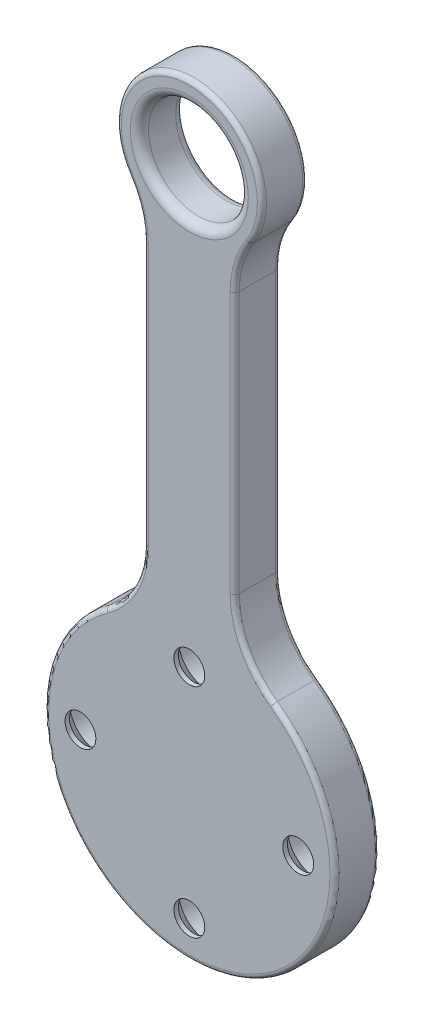
ISO-10303-21;
HEADER;
FILE_DESCRIPTION(('STEP AP214'),'2;1');
FILE_NAME('part.step','',(''),(''),'','','');
FILE_SCHEMA(('AUTOMOTIVE_DESIGN { 1 0 10303 214 1 1 1 1 }'));
ENDSEC;
DATA;
#1=APPLICATION_CONTEXT('core data for automotive mechanical design processes');
#2=APPLICATION_PROTOCOL_DEFINITION('international standard','automotive_design',2000,#1);
#3=PRODUCT_CONTEXT('',#1,'mechanical');
#4=PRODUCT('Part','Part','',(#3));
#5=PRODUCT_RELATED_PRODUCT_CATEGORY('part','',(#4));
#6=PRODUCT_DEFINITION_FORMATION('','',#4);
#7=PRODUCT_DEFINITION_CONTEXT('part definition',#1,'design');
#8=PRODUCT_DEFINITION('design','',#6,#7);
#9=PRODUCT_DEFINITION_SHAPE('','',#8);
#10=(LENGTH_UNIT() NAMED_UNIT(*) SI_UNIT(.MILLI.,.METRE.));
#11=(NAMED_UNIT(*) PLANE_ANGLE_UNIT() SI_UNIT($,.RADIAN.));
#12=(NAMED_UNIT(*) SI_UNIT($,.STERADIAN.) SOLID_ANGLE_UNIT());
#13=UNCERTAINTY_MEASURE_WITH_UNIT(LENGTH_MEASURE(1.E-05),#10,'distance_accuracy_value','');
#14=(GEOMETRIC_REPRESENTATION_CONTEXT(3) GLOBAL_UNCERTAINTY_ASSIGNED_CONTEXT((#13)) GLOBAL_UNIT_ASSIGNED_CONTEXT((#10,
#11,#12)) REPRESENTATION_CONTEXT('',''));
#15=CARTESIAN_POINT('',(0.,0.,0.));
#16=DIRECTION('',(0.,0.,1.));
#17=DIRECTION('',(1.,0.,0.));
#18=AXIS2_PLACEMENT_3D('',#15,#16,#17);
#19=CARTESIAN_POINT('',(0.,60.,0.));
#20=DIRECTION('',(0.,0.,1.));
#21=DIRECTION('',(1.,0.,0.));
#22=AXIS2_PLACEMENT_3D('',#19,#20,#21);
#23=CYLINDRICAL_SURFACE('',#22,8.);
#24=DIRECTION('',(0.,0.,1.));
#25=VECTOR('',#24,1.);
#26=CARTESIAN_POINT('',(6.66666666666667,55.5778336128595,0.));
#27=LINE('',#26,#25);
#28=CARTESIAN_POINT('',(6.66666666666667,55.5778336128595,4.5));
#29=VERTEX_POINT('',#28);
#30=CARTESIAN_POINT('',(6.66666666666667,55.5778336128595,0.5));
#31=VERTEX_POINT('',#30);
#32=EDGE_CURVE('E475',#29,#31,#27,.F.);
#33=ORIENTED_EDGE('',*,*,#32,.T.);
#34=CARTESIAN_POINT('',(0.,60.,0.5));
#35=DIRECTION('',(0.,0.,1.));
#36=DIRECTION('',(1.,0.,0.));
#37=AXIS2_PLACEMENT_3D('',#34,#35,#36);
#38=CIRCLE('',#37,8.);
#39=CARTESIAN_POINT('',(-6.66666666666667,55.5778336128595,0.5));
#40=VERTEX_POINT('',#39);
#41=EDGE_CURVE('E207',#31,#40,#38,.T.);
#42=ORIENTED_EDGE('',*,*,#41,.T.);
#43=DIRECTION('',(0.,0.,1.));
#44=VECTOR('',#43,1.);
#45=CARTESIAN_POINT('',(-6.66666666666667,55.5778336128595,0.));
#46=LINE('',#45,#44);
#47=CARTESIAN_POINT('',(-6.66666666666667,55.5778336128595,4.5));
#48=VERTEX_POINT('',#47);
#49=EDGE_CURVE('E477',#40,#48,#46,.T.);
#50=ORIENTED_EDGE('',*,*,#49,.T.);
#51=CARTESIAN_POINT('',(0.,60.,4.5));
#52=DIRECTION('',(0.,0.,1.));
#53=DIRECTION('',(1.,0.,0.));
#54=AXIS2_PLACEMENT_3D('',#51,#52,#53);
#55=CIRCLE('',#54,8.);
#56=EDGE_CURVE('E205',#48,#29,#55,.F.);
#57=ORIENTED_EDGE('',*,*,#56,.T.);
#58=EDGE_LOOP('',(#33,#42,#50,#57));
#59=FACE_BOUND('',#58,.T.);
#60=ADVANCED_FACE('F44',(#59),#23,.T.);
#61=CARTESIAN_POINT('',(5.,13.076696830622,0.));
#62=DIRECTION('',(1.,0.,0.));
#63=DIRECTION('',(0.,1.,0.));
#64=AXIS2_PLACEMENT_3D('',#61,#62,#63);
#65=PLANE('',#64);
#66=DIRECTION('',(0.,0.,1.));
#67=VECTOR('',#66,1.);
#68=CARTESIAN_POINT('',(5.,21.2367605815953,0.));
#69=LINE('',#68,#67);
#70=CARTESIAN_POINT('',(5.,21.2367605815953,4.5));
#71=VERTEX_POINT('',#70);
#72=CARTESIAN_POINT('',(5.,21.2367605815953,0.5));
#73=VERTEX_POINT('',#72);
#74=EDGE_CURVE('E466',#71,#73,#69,.F.);
#75=ORIENTED_EDGE('',*,*,#74,.T.);
#76=DIRECTION('',(0.,1.,0.));
#77=VECTOR('',#76,1.);
#78=CARTESIAN_POINT('',(5.,50.0501256289338,0.5));
#79=LINE('',#78,#77);
#80=CARTESIAN_POINT('',(5.,50.0501256289338,0.5));
#81=VERTEX_POINT('',#80);
#82=EDGE_CURVE('E199',#73,#81,#79,.T.);
#83=ORIENTED_EDGE('',*,*,#82,.T.);
#84=DIRECTION('',(0.,0.,-1.));
#85=VECTOR('',#84,1.);
#86=CARTESIAN_POINT('',(5.,50.0501256289338,5.));
#87=LINE('',#86,#85);
#88=CARTESIAN_POINT('',(5.,50.0501256289338,4.5));
#89=VERTEX_POINT('',#88);
#90=EDGE_CURVE('E463',#81,#89,#87,.F.);
#91=ORIENTED_EDGE('',*,*,#90,.T.);
#92=DIRECTION('',(0.,1.,0.));
#93=VECTOR('',#92,1.);
#94=CARTESIAN_POINT('',(5.,13.076696830622,4.5));
#95=LINE('',#94,#93);
#96=EDGE_CURVE('E197',#89,#71,#95,.F.);
#97=ORIENTED_EDGE('',*,*,#96,.T.);
#98=EDGE_LOOP('',(#75,#83,#91,#97));
#99=FACE_BOUND('',#98,.T.);
#100=ADVANCED_FACE('F311',(#99),#65,.T.);
#101=CARTESIAN_POINT('',(-5.,53.7550020016016,0.));
#102=DIRECTION('',(-1.,0.,0.));
#103=DIRECTION('',(0.,-1.,0.));
#104=AXIS2_PLACEMENT_3D('',#101,#102,#103);
#105=PLANE('',#104);
#106=DIRECTION('',(0.,0.,-1.));
#107=VECTOR('',#106,1.);
#108=CARTESIAN_POINT('',(-5.,50.0501256289338,0.));
#109=LINE('',#108,#107);
#110=CARTESIAN_POINT('',(-5.,50.0501256289338,4.5));
#111=VERTEX_POINT('',#110);
#112=CARTESIAN_POINT('',(-5.,50.0501256289338,0.5));
#113=VERTEX_POINT('',#112);
#114=EDGE_CURVE('E469',#111,#113,#109,.T.);
#115=ORIENTED_EDGE('',*,*,#114,.T.);
#116=DIRECTION('',(0.,-1.,0.));
#117=VECTOR('',#116,1.);
#118=CARTESIAN_POINT('',(-5.,21.2367605815953,0.5));
#119=LINE('',#118,#117);
#120=CARTESIAN_POINT('',(-5.,21.2367605815953,0.5));
#121=VERTEX_POINT('',#120);
#122=EDGE_CURVE('E215',#113,#121,#119,.T.);
#123=ORIENTED_EDGE('',*,*,#122,.T.);
#124=DIRECTION('',(0.,0.,1.));
#125=VECTOR('',#124,1.);
#126=CARTESIAN_POINT('',(-5.,21.2367605815953,5.));
#127=LINE('',#126,#125);
#128=CARTESIAN_POINT('',(-5.,21.2367605815953,4.5));
#129=VERTEX_POINT('',#128);
#130=EDGE_CURVE('E472',#121,#129,#127,.T.);
#131=ORIENTED_EDGE('',*,*,#130,.T.);
#132=DIRECTION('',(0.,-1.,0.));
#133=VECTOR('',#132,1.);
#134=CARTESIAN_POINT('',(-5.,53.7550020016016,4.5));
#135=LINE('',#134,#133);
#136=EDGE_CURVE('E213',#129,#111,#135,.F.);
#137=ORIENTED_EDGE('',*,*,#136,.T.);
#138=EDGE_LOOP('',(#115,#123,#131,#137));
#139=FACE_BOUND('',#138,.T.);
#140=ADVANCED_FACE('F317',(#139),#105,.T.);
#141=CARTESIAN_POINT('',(0.,60.,0.));
#142=DIRECTION('',(0.,0.,1.));
#143=DIRECTION('',(1.,0.,0.));
#144=AXIS2_PLACEMENT_3D('',#141,#142,#143);
#145=PLANE('',#144);
#146=DIRECTION('',(0.,1.,0.));
#147=VECTOR('',#146,1.);
#148=CARTESIAN_POINT('',(4.5,21.2367605815953,0.));
#149=LINE('',#148,#147);
#150=CARTESIAN_POINT('',(4.5,50.0501256289338,0.));
#151=VERTEX_POINT('',#150);
#152=CARTESIAN_POINT('',(4.5,21.2367605815953,0.));
#153=VERTEX_POINT('',#152);
#154=EDGE_CURVE('E186',#151,#153,#149,.F.);
#155=ORIENTED_EDGE('',*,*,#154,.T.);
#156=CARTESIAN_POINT('',(15.,21.2367605815953,0.));
#157=DIRECTION('',(0.,0.,1.));
#158=DIRECTION('',(1.,0.,0.));
#159=AXIS2_PLACEMENT_3D('',#156,#157,#158);
#160=CIRCLE('',#159,10.5);
#161=CARTESIAN_POINT('',(8.94230769230769,12.6603765005664,0.));
#162=VERTEX_POINT('',#161);
#163=EDGE_CURVE('E165',#153,#162,#160,.T.);
#164=ORIENTED_EDGE('',*,*,#163,.T.);
#165=CARTESIAN_POINT('',(0.,0.,0.));
#166=DIRECTION('',(0.,0.,1.));
#167=DIRECTION('',(1.,0.,0.));
#168=AXIS2_PLACEMENT_3D('',#165,#166,#167);
#169=CIRCLE('',#168,15.5);
#170=CARTESIAN_POINT('',(-8.94230769230769,12.6603765005664,0.));
#171=VERTEX_POINT('',#170);
#172=EDGE_CURVE('E174',#162,#171,#169,.F.);
#173=ORIENTED_EDGE('',*,*,#172,.T.);
#174=CARTESIAN_POINT('',(-15.,21.2367605815953,0.));
#175=DIRECTION('',(0.,0.,1.));
#176=DIRECTION('',(1.,0.,0.));
#177=AXIS2_PLACEMENT_3D('',#174,#175,#176);
#178=CIRCLE('',#177,10.5);
#179=CARTESIAN_POINT('',(-4.5,21.2367605815953,0.));
#180=VERTEX_POINT('',#179);
#181=EDGE_CURVE('E180',#171,#180,#178,.T.);
#182=ORIENTED_EDGE('',*,*,#181,.T.);
#183=DIRECTION('',(0.,-1.,0.));
#184=VECTOR('',#183,1.);
#185=CARTESIAN_POINT('',(-4.5,50.0501256289338,0.));
#186=LINE('',#185,#184);
#187=CARTESIAN_POINT('',(-4.5,50.0501256289338,0.));
#188=VERTEX_POINT('',#187);
#189=EDGE_CURVE('E492',#180,#188,#186,.F.);
#190=ORIENTED_EDGE('',*,*,#189,.T.);
#191=CARTESIAN_POINT('',(-15.,50.0501256289338,0.));
#192=DIRECTION('',(0.,0.,1.));
#193=DIRECTION('',(1.,0.,0.));
#194=AXIS2_PLACEMENT_3D('',#191,#192,#193);
#195=CIRCLE('',#194,10.5);
#196=CARTESIAN_POINT('',(-6.25,55.8542190120558,0.));
#197=VERTEX_POINT('',#196);
#198=EDGE_CURVE('E494',#188,#197,#195,.T.);
#199=ORIENTED_EDGE('',*,*,#198,.T.);
#200=CARTESIAN_POINT('',(0.,60.,0.));
#201=DIRECTION('',(0.,0.,1.));
#202=DIRECTION('',(1.,0.,0.));
#203=AXIS2_PLACEMENT_3D('',#200,#201,#202);
#204=CIRCLE('',#203,7.5);
#205=CARTESIAN_POINT('',(6.25,55.8542190120558,0.));
#206=VERTEX_POINT('',#205);
#207=EDGE_CURVE('E496',#197,#206,#204,.F.);
#208=ORIENTED_EDGE('',*,*,#207,.T.);
#209=CARTESIAN_POINT('',(15.,50.0501256289338,0.));
#210=DIRECTION('',(0.,0.,1.));
#211=DIRECTION('',(1.,0.,0.));
#212=AXIS2_PLACEMENT_3D('',#209,#210,#211);
#213=CIRCLE('',#212,10.5);
#214=EDGE_CURVE('E192',#206,#151,#213,.T.);
#215=ORIENTED_EDGE('',*,*,#214,.T.);
#216=EDGE_LOOP('',(#155,#164,#173,#182,#190,#199,#208,#215));
#217=FACE_BOUND('',#216,.T.);
#218=CARTESIAN_POINT('',(0.,60.,0.));
#219=DIRECTION('',(0.,0.,1.));
#220=DIRECTION('',(1.,0.,0.));
#221=AXIS2_PLACEMENT_3D('',#218,#219,#220);
#222=CIRCLE('',#221,6.5);
#223=CARTESIAN_POINT('',(6.5,60.,0.));
#224=VERTEX_POINT('',#223);
#225=EDGE_CURVE('E181',#224,#224,#222,.T.);
#226=ORIENTED_EDGE('',*,*,#225,.T.);
#227=EDGE_LOOP('',(#226));
#228=FACE_BOUND('',#227,.T.);
#229=CARTESIAN_POINT('',(0.,12.,0.));
#230=DIRECTION('',(0.,0.,-1.));
#231=DIRECTION('',(-1.,0.,0.));
#232=AXIS2_PLACEMENT_3D('',#229,#230,#231);
#233=CIRCLE('',#232,3.25);
#234=CARTESIAN_POINT('',(-3.25,12.,0.));
#235=VERTEX_POINT('',#234);
#236=EDGE_CURVE('E258',#235,#235,#233,.T.);
#237=ORIENTED_EDGE('',*,*,#236,.F.);
#238=EDGE_LOOP('',(#237));
#239=FACE_BOUND('',#238,.T.);
#240=CARTESIAN_POINT('',(-12.,0.,0.));
#241=DIRECTION('',(0.,0.,-1.));
#242=DIRECTION('',(-1.,0.,0.));
#243=AXIS2_PLACEMENT_3D('',#240,#241,#242);
#244=CIRCLE('',#243,3.25);
#245=CARTESIAN_POINT('',(-15.25,0.,0.));
#246=VERTEX_POINT('',#245);
#247=EDGE_CURVE('E621',#246,#246,#244,.T.);
#248=ORIENTED_EDGE('',*,*,#247,.F.);
#249=EDGE_LOOP('',(#248));
#250=FACE_BOUND('',#249,.T.);
#251=CARTESIAN_POINT('',(12.,0.,0.));
#252=DIRECTION('',(0.,0.,-1.));
#253=DIRECTION('',(-1.,0.,0.));
#254=AXIS2_PLACEMENT_3D('',#251,#252,#253);
#255=CIRCLE('',#254,3.25);
#256=CARTESIAN_POINT('',(8.75,0.,0.));
#257=VERTEX_POINT('',#256);
#258=EDGE_CURVE('E448',#257,#257,#255,.T.);
#259=ORIENTED_EDGE('',*,*,#258,.F.);
#260=EDGE_LOOP('',(#259));
#261=FACE_BOUND('',#260,.T.);
#262=CARTESIAN_POINT('',(0.,-12.,0.));
#263=DIRECTION('',(0.,0.,-1.));
#264=DIRECTION('',(-1.,0.,0.));
#265=AXIS2_PLACEMENT_3D('',#262,#263,#264);
#266=CIRCLE('',#265,3.25);
#267=CARTESIAN_POINT('',(-3.25,-12.,0.));
#268=VERTEX_POINT('',#267);
#269=EDGE_CURVE('E441',#268,#268,#266,.T.);
#270=ORIENTED_EDGE('',*,*,#269,.F.);
#271=EDGE_LOOP('',(#270));
#272=FACE_BOUND('',#271,.T.);
#273=ADVANCED_FACE('F183',(#217,#228,#239,#250,#261,#272),#145,.F.);
#274=CARTESIAN_POINT('',(0.,60.,5.));
#275=DIRECTION('',(0.,0.,1.));
#276=DIRECTION('',(1.,0.,0.));
#277=AXIS2_PLACEMENT_3D('',#274,#275,#276);
#278=PLANE('',#277);
#279=CARTESIAN_POINT('',(0.,0.,5.));
#280=DIRECTION('',(0.,0.,1.));
#281=DIRECTION('',(1.,0.,0.));
#282=AXIS2_PLACEMENT_3D('',#279,#280,#281);
#283=CIRCLE('',#282,15.5);
#284=CARTESIAN_POINT('',(-8.94230769230769,12.6603765005664,5.));
#285=VERTEX_POINT('',#284);
#286=CARTESIAN_POINT('',(8.94230769230769,12.6603765005664,5.));
#287=VERTEX_POINT('',#286);
#288=EDGE_CURVE('E221',#285,#287,#283,.T.);
#289=ORIENTED_EDGE('',*,*,#288,.T.);
#290=CARTESIAN_POINT('',(15.,21.2367605815953,5.));
#291=DIRECTION('',(0.,0.,1.));
#292=DIRECTION('',(1.,0.,0.));
#293=AXIS2_PLACEMENT_3D('',#290,#291,#292);
#294=CIRCLE('',#293,10.5);
#295=CARTESIAN_POINT('',(4.5,21.2367605815953,5.));
#296=VERTEX_POINT('',#295);
#297=EDGE_CURVE('E234',#287,#296,#294,.F.);
#298=ORIENTED_EDGE('',*,*,#297,.T.);
#299=DIRECTION('',(0.,1.,0.));
#300=VECTOR('',#299,1.);
#301=CARTESIAN_POINT('',(4.5,60.,5.));
#302=LINE('',#301,#300);
#303=CARTESIAN_POINT('',(4.5,50.0501256289338,5.));
#304=VERTEX_POINT('',#303);
#305=EDGE_CURVE('E67',#296,#304,#302,.T.);
#306=ORIENTED_EDGE('',*,*,#305,.T.);
#307=CARTESIAN_POINT('',(15.,50.0501256289338,5.));
#308=DIRECTION('',(0.,0.,1.));
#309=DIRECTION('',(1.,0.,0.));
#310=AXIS2_PLACEMENT_3D('',#307,#308,#309);
#311=CIRCLE('',#310,10.5);
#312=CARTESIAN_POINT('',(6.25,55.8542190120558,5.));
#313=VERTEX_POINT('',#312);
#314=EDGE_CURVE('E231',#304,#313,#311,.F.);
#315=ORIENTED_EDGE('',*,*,#314,.T.);
#316=CARTESIAN_POINT('',(0.,60.,5.));
#317=DIRECTION('',(0.,0.,1.));
#318=DIRECTION('',(1.,0.,0.));
#319=AXIS2_PLACEMENT_3D('',#316,#317,#318);
#320=CIRCLE('',#319,7.5);
#321=CARTESIAN_POINT('',(-6.25,55.8542190120558,5.));
#322=VERTEX_POINT('',#321);
#323=EDGE_CURVE('E229',#313,#322,#320,.T.);
#324=ORIENTED_EDGE('',*,*,#323,.T.);
#325=CARTESIAN_POINT('',(-15.,50.0501256289338,5.));
#326=DIRECTION('',(0.,0.,1.));
#327=DIRECTION('',(1.,0.,0.));
#328=AXIS2_PLACEMENT_3D('',#325,#326,#327);
#329=CIRCLE('',#328,10.5);
#330=CARTESIAN_POINT('',(-4.5,50.0501256289338,5.));
#331=VERTEX_POINT('',#330);
#332=EDGE_CURVE('E227',#322,#331,#329,.F.);
#333=ORIENTED_EDGE('',*,*,#332,.T.);
#334=DIRECTION('',(0.,-1.,0.));
#335=VECTOR('',#334,1.);
#336=CARTESIAN_POINT('',(-4.5,60.,5.));
#337=LINE('',#336,#335);
#338=CARTESIAN_POINT('',(-4.5,21.2367605815953,5.));
#339=VERTEX_POINT('',#338);
#340=EDGE_CURVE('E225',#331,#339,#337,.T.);
#341=ORIENTED_EDGE('',*,*,#340,.T.);
#342=CARTESIAN_POINT('',(-15.,21.2367605815953,5.));
#343=DIRECTION('',(0.,0.,1.));
#344=DIRECTION('',(1.,0.,0.));
#345=AXIS2_PLACEMENT_3D('',#342,#343,#344);
#346=CIRCLE('',#345,10.5);
#347=EDGE_CURVE('E223',#339,#285,#346,.F.);
#348=ORIENTED_EDGE('',*,*,#347,.T.);
#349=EDGE_LOOP('',(#289,#298,#306,#315,#324,#333,#341,#348));
#350=FACE_BOUND('',#349,.T.);
#351=CARTESIAN_POINT('',(0.,60.,5.));
#352=DIRECTION('',(0.,0.,1.));
#353=DIRECTION('',(1.,0.,0.));
#354=AXIS2_PLACEMENT_3D('',#351,#352,#353);
#355=CIRCLE('',#354,6.5);
#356=CARTESIAN_POINT('',(6.5,60.,5.));
#357=VERTEX_POINT('',#356);
#358=EDGE_CURVE('E480',#357,#357,#355,.F.);
#359=ORIENTED_EDGE('',*,*,#358,.T.);
#360=EDGE_LOOP('',(#359));
#361=FACE_BOUND('',#360,.T.);
#362=CARTESIAN_POINT('',(0.,12.,5.));
#363=DIRECTION('',(0.,0.,-1.));
#364=DIRECTION('',(-1.,0.,0.));
#365=AXIS2_PLACEMENT_3D('',#362,#363,#364);
#366=CIRCLE('',#365,1.70000000000001);
#367=CARTESIAN_POINT('',(-1.70000000000001,12.,5.));
#368=VERTEX_POINT('',#367);
#369=EDGE_CURVE('E609',#368,#368,#366,.T.);
#370=ORIENTED_EDGE('',*,*,#369,.T.);
#371=EDGE_LOOP('',(#370));
#372=FACE_BOUND('',#371,.T.);
#373=CARTESIAN_POINT('',(-12.,0.,5.));
#374=DIRECTION('',(0.,0.,-1.));
#375=DIRECTION('',(-1.,0.,0.));
#376=AXIS2_PLACEMENT_3D('',#373,#374,#375);
#377=CIRCLE('',#376,1.70000000000001);
#378=CARTESIAN_POINT('',(-13.7,0.,5.));
#379=VERTEX_POINT('',#378);
#380=EDGE_CURVE('E612',#379,#379,#377,.T.);
#381=ORIENTED_EDGE('',*,*,#380,.T.);
#382=EDGE_LOOP('',(#381));
#383=FACE_BOUND('',#382,.T.);
#384=CARTESIAN_POINT('',(12.,0.,5.));
#385=DIRECTION('',(0.,0.,-1.));
#386=DIRECTION('',(-1.,0.,0.));
#387=AXIS2_PLACEMENT_3D('',#384,#385,#386);
#388=CIRCLE('',#387,1.70000000000001);
#389=CARTESIAN_POINT('',(10.3,0.,5.));
#390=VERTEX_POINT('',#389);
#391=EDGE_CURVE('E439',#390,#390,#388,.T.);
#392=ORIENTED_EDGE('',*,*,#391,.T.);
#393=EDGE_LOOP('',(#392));
#394=FACE_BOUND('',#393,.T.);
#395=CARTESIAN_POINT('',(0.,-12.,5.));
#396=DIRECTION('',(0.,0.,-1.));
#397=DIRECTION('',(-1.,0.,0.));
#398=AXIS2_PLACEMENT_3D('',#395,#396,#397);
#399=CIRCLE('',#398,1.70000000000001);
#400=CARTESIAN_POINT('',(-1.70000000000001,-12.,5.));
#401=VERTEX_POINT('',#400);
#402=EDGE_CURVE('E454',#401,#401,#399,.T.);
#403=ORIENTED_EDGE('',*,*,#402,.T.);
#404=EDGE_LOOP('',(#403));
#405=FACE_BOUND('',#404,.T.);
#406=ADVANCED_FACE('F508',(#350,#361,#372,#383,#394,#405),#278,.T.);
#407=CARTESIAN_POINT('',(0.,0.,5.));
#408=DIRECTION('',(0.,0.,-1.));
#409=DIRECTION('',(-1.,0.,0.));
#410=AXIS2_PLACEMENT_3D('',#407,#408,#409);
#411=CYLINDRICAL_SURFACE('',#410,16.);
#412=DIRECTION('',(0.,0.,-1.));
#413=VECTOR('',#412,1.);
#414=CARTESIAN_POINT('',(-9.23076923076923,13.0687757425202,5.));
#415=LINE('',#414,#413);
#416=CARTESIAN_POINT('',(-9.23076923076923,13.0687757425202,4.5));
#417=VERTEX_POINT('',#416);
#418=CARTESIAN_POINT('',(-9.23076923076923,13.0687757425202,0.5));
#419=VERTEX_POINT('',#418);
#420=EDGE_CURVE('E457',#417,#419,#415,.T.);
#421=ORIENTED_EDGE('',*,*,#420,.T.);
#422=CARTESIAN_POINT('',(0.,0.,0.5));
#423=DIRECTION('',(0.,0.,1.));
#424=DIRECTION('',(1.,0.,0.));
#425=AXIS2_PLACEMENT_3D('',#422,#423,#424);
#426=CIRCLE('',#425,16.);
#427=CARTESIAN_POINT('',(9.23076923076923,13.0687757425202,0.5));
#428=VERTEX_POINT('',#427);
#429=EDGE_CURVE('E238',#419,#428,#426,.T.);
#430=ORIENTED_EDGE('',*,*,#429,.T.);
#431=DIRECTION('',(0.,0.,-1.));
#432=VECTOR('',#431,1.);
#433=CARTESIAN_POINT('',(9.23076923076923,13.0687757425202,5.));
#434=LINE('',#433,#432);
#435=CARTESIAN_POINT('',(9.23076923076923,13.0687757425202,4.5));
#436=VERTEX_POINT('',#435);
#437=EDGE_CURVE('E460',#428,#436,#434,.F.);
#438=ORIENTED_EDGE('',*,*,#437,.T.);
#439=CARTESIAN_POINT('',(0.,0.,4.5));
#440=DIRECTION('',(0.,0.,1.));
#441=DIRECTION('',(1.,0.,0.));
#442=AXIS2_PLACEMENT_3D('',#439,#440,#441);
#443=CIRCLE('',#442,16.);
#444=EDGE_CURVE('E236',#436,#417,#443,.F.);
#445=ORIENTED_EDGE('',*,*,#444,.T.);
#446=EDGE_LOOP('',(#421,#430,#438,#445));
#447=FACE_BOUND('',#446,.T.);
#448=ADVANCED_FACE('F516',(#447),#411,.T.);
#449=CARTESIAN_POINT('',(0.,-12.,0.));
#450=DIRECTION('',(0.,0.,-1.));
#451=DIRECTION('',(-1.,0.,0.));
#452=AXIS2_PLACEMENT_3D('',#449,#450,#451);
#453=CYLINDRICAL_SURFACE('',#452,1.70000000000001);
#454=CARTESIAN_POINT('',(0.,-12.,4.50000000000002));
#455=DIRECTION('',(0.,0.,1.));
#456=DIRECTION('',(1.,0.,0.));
#457=AXIS2_PLACEMENT_3D('',#454,#455,#456);
#458=CIRCLE('',#457,1.70000000000001);
#459=CARTESIAN_POINT('',(1.70000000000001,-12.,4.50000000000002));
#460=VERTEX_POINT('',#459);
#461=EDGE_CURVE('E239',#460,#460,#458,.F.);
#462=ORIENTED_EDGE('',*,*,#461,.T.);
#463=EDGE_LOOP('',(#462));
#464=FACE_BOUND('',#463,.T.);
#465=ORIENTED_EDGE('',*,*,#402,.F.);
#466=EDGE_LOOP('',(#465));
#467=FACE_BOUND('',#466,.T.);
#468=ADVANCED_FACE('F556',(#464,#467),#453,.F.);
#469=CARTESIAN_POINT('',(1.70000000000001,-12.,3.));
#470=DIRECTION('',(0.,0.,1.));
#471=DIRECTION('',(1.,0.,0.));
#472=AXIS2_PLACEMENT_3D('',#469,#470,#471);
#473=PLANE('',#472);
#474=CARTESIAN_POINT('',(0.,-12.,3.));
#475=DIRECTION('',(0.,0.,1.));
#476=DIRECTION('',(1.,0.,0.));
#477=AXIS2_PLACEMENT_3D('',#474,#475,#476);
#478=CIRCLE('',#477,3.20000000000002);
#479=CARTESIAN_POINT('',(3.20000000000002,-12.,3.));
#480=VERTEX_POINT('',#479);
#481=EDGE_CURVE('E281',#480,#480,#478,.T.);
#482=ORIENTED_EDGE('',*,*,#481,.T.);
#483=EDGE_LOOP('',(#482));
#484=FACE_BOUND('',#483,.T.);
#485=CARTESIAN_POINT('',(0.,-12.,3.));
#486=DIRECTION('',(0.,0.,-1.));
#487=DIRECTION('',(-1.,0.,0.));
#488=AXIS2_PLACEMENT_3D('',#485,#486,#487);
#489=CIRCLE('',#488,3.25);
#490=CARTESIAN_POINT('',(-3.25,-12.,3.));
#491=VERTEX_POINT('',#490);
#492=EDGE_CURVE('E445',#491,#491,#489,.T.);
#493=ORIENTED_EDGE('',*,*,#492,.T.);
#494=EDGE_LOOP('',(#493));
#495=FACE_BOUND('',#494,.T.);
#496=ADVANCED_FACE('F559',(#484,#495),#473,.F.);
#497=CARTESIAN_POINT('',(0.,-12.,0.));
#498=DIRECTION('',(0.,0.,-1.));
#499=DIRECTION('',(-1.,0.,0.));
#500=AXIS2_PLACEMENT_3D('',#497,#498,#499);
#501=CYLINDRICAL_SURFACE('',#500,3.25);
#502=ORIENTED_EDGE('',*,*,#492,.F.);
#503=EDGE_LOOP('',(#502));
#504=FACE_BOUND('',#503,.T.);
#505=ORIENTED_EDGE('',*,*,#269,.T.);
#506=EDGE_LOOP('',(#505));
#507=FACE_BOUND('',#506,.T.);
#508=ADVANCED_FACE('F435',(#504,#507),#501,.F.);
#509=CARTESIAN_POINT('',(12.,0.,0.));
#510=DIRECTION('',(0.,0.,-1.));
#511=DIRECTION('',(-1.,0.,0.));
#512=AXIS2_PLACEMENT_3D('',#509,#510,#511);
#513=CYLINDRICAL_SURFACE('',#512,1.70000000000001);
#514=CARTESIAN_POINT('',(12.,0.,4.50000000000002));
#515=DIRECTION('',(0.,0.,1.));
#516=DIRECTION('',(1.,0.,0.));
#517=AXIS2_PLACEMENT_3D('',#514,#515,#516);
#518=CIRCLE('',#517,1.70000000000001);
#519=CARTESIAN_POINT('',(13.7,0.,4.50000000000002));
#520=VERTEX_POINT('',#519);
#521=EDGE_CURVE('E284',#520,#520,#518,.F.);
#522=ORIENTED_EDGE('',*,*,#521,.T.);
#523=EDGE_LOOP('',(#522));
#524=FACE_BOUND('',#523,.T.);
#525=ORIENTED_EDGE('',*,*,#391,.F.);
#526=EDGE_LOOP('',(#525));
#527=FACE_BOUND('',#526,.T.);
#528=ADVANCED_FACE('F431',(#524,#527),#513,.F.);
#529=CARTESIAN_POINT('',(13.7,0.,3.));
#530=DIRECTION('',(0.,0.,1.));
#531=DIRECTION('',(1.,0.,0.));
#532=AXIS2_PLACEMENT_3D('',#529,#530,#531);
#533=PLANE('',#532);
#534=CARTESIAN_POINT('',(12.,0.,3.));
#535=DIRECTION('',(0.,0.,1.));
#536=DIRECTION('',(1.,0.,0.));
#537=AXIS2_PLACEMENT_3D('',#534,#535,#536);
#538=CIRCLE('',#537,3.20000000000002);
#539=CARTESIAN_POINT('',(15.2,0.,3.));
#540=VERTEX_POINT('',#539);
#541=EDGE_CURVE('E287',#540,#540,#538,.T.);
#542=ORIENTED_EDGE('',*,*,#541,.T.);
#543=EDGE_LOOP('',(#542));
#544=FACE_BOUND('',#543,.T.);
#545=CARTESIAN_POINT('',(12.,0.,3.));
#546=DIRECTION('',(0.,0.,-1.));
#547=DIRECTION('',(-1.,0.,0.));
#548=AXIS2_PLACEMENT_3D('',#545,#546,#547);
#549=CIRCLE('',#548,3.25);
#550=CARTESIAN_POINT('',(8.75,0.,3.));
#551=VERTEX_POINT('',#550);
#552=EDGE_CURVE('E442',#551,#551,#549,.T.);
#553=ORIENTED_EDGE('',*,*,#552,.T.);
#554=EDGE_LOOP('',(#553));
#555=FACE_BOUND('',#554,.T.);
#556=ADVANCED_FACE('F434',(#544,#555),#533,.F.);
#557=CARTESIAN_POINT('',(12.,0.,0.));
#558=DIRECTION('',(0.,0.,-1.));
#559=DIRECTION('',(-1.,0.,0.));
#560=AXIS2_PLACEMENT_3D('',#557,#558,#559);
#561=CYLINDRICAL_SURFACE('',#560,3.25);
#562=ORIENTED_EDGE('',*,*,#552,.F.);
#563=EDGE_LOOP('',(#562));
#564=FACE_BOUND('',#563,.T.);
#565=ORIENTED_EDGE('',*,*,#258,.T.);
#566=EDGE_LOOP('',(#565));
#567=FACE_BOUND('',#566,.T.);
#568=ADVANCED_FACE('F569',(#564,#567),#561,.F.);
#569=CARTESIAN_POINT('',(-12.,0.,0.));
#570=DIRECTION('',(0.,0.,-1.));
#571=DIRECTION('',(-1.,0.,0.));
#572=AXIS2_PLACEMENT_3D('',#569,#570,#571);
#573=CYLINDRICAL_SURFACE('',#572,1.70000000000001);
#574=CARTESIAN_POINT('',(-12.,0.,4.50000000000002));
#575=DIRECTION('',(0.,0.,1.));
#576=DIRECTION('',(1.,0.,0.));
#577=AXIS2_PLACEMENT_3D('',#574,#575,#576);
#578=CIRCLE('',#577,1.70000000000001);
#579=CARTESIAN_POINT('',(-10.3,0.,4.50000000000002));
#580=VERTEX_POINT('',#579);
#581=EDGE_CURVE('E290',#580,#580,#578,.F.);
#582=ORIENTED_EDGE('',*,*,#581,.T.);
#583=EDGE_LOOP('',(#582));
#584=FACE_BOUND('',#583,.T.);
#585=ORIENTED_EDGE('',*,*,#380,.F.);
#586=EDGE_LOOP('',(#585));
#587=FACE_BOUND('',#586,.T.);
#588=ADVANCED_FACE('F573',(#584,#587),#573,.F.);
#589=CARTESIAN_POINT('',(-10.3,0.,3.));
#590=DIRECTION('',(0.,0.,1.));
#591=DIRECTION('',(1.,0.,0.));
#592=AXIS2_PLACEMENT_3D('',#589,#590,#591);
#593=PLANE('',#592);
#594=CARTESIAN_POINT('',(-12.,0.,3.));
#595=DIRECTION('',(0.,0.,1.));
#596=DIRECTION('',(1.,0.,0.));
#597=AXIS2_PLACEMENT_3D('',#594,#595,#596);
#598=CIRCLE('',#597,3.20000000000002);
#599=CARTESIAN_POINT('',(-8.79999999999998,0.,3.));
#600=VERTEX_POINT('',#599);
#601=EDGE_CURVE('E293',#600,#600,#598,.T.);
#602=ORIENTED_EDGE('',*,*,#601,.T.);
#603=EDGE_LOOP('',(#602));
#604=FACE_BOUND('',#603,.T.);
#605=CARTESIAN_POINT('',(-12.,0.,3.));
#606=DIRECTION('',(0.,0.,-1.));
#607=DIRECTION('',(-1.,0.,0.));
#608=AXIS2_PLACEMENT_3D('',#605,#606,#607);
#609=CIRCLE('',#608,3.25);
#610=CARTESIAN_POINT('',(-15.25,0.,3.));
#611=VERTEX_POINT('',#610);
#612=EDGE_CURVE('E617',#611,#611,#609,.T.);
#613=ORIENTED_EDGE('',*,*,#612,.T.);
#614=EDGE_LOOP('',(#613));
#615=FACE_BOUND('',#614,.T.);
#616=ADVANCED_FACE('F577',(#604,#615),#593,.F.);
#617=CARTESIAN_POINT('',(-12.,0.,0.));
#618=DIRECTION('',(0.,0.,-1.));
#619=DIRECTION('',(-1.,0.,0.));
#620=AXIS2_PLACEMENT_3D('',#617,#618,#619);
#621=CYLINDRICAL_SURFACE('',#620,3.25);
#622=ORIENTED_EDGE('',*,*,#612,.F.);
#623=EDGE_LOOP('',(#622));
#624=FACE_BOUND('',#623,.T.);
#625=ORIENTED_EDGE('',*,*,#247,.T.);
#626=EDGE_LOOP('',(#625));
#627=FACE_BOUND('',#626,.T.);
#628=ADVANCED_FACE('F581',(#624,#627),#621,.F.);
#629=CARTESIAN_POINT('',(0.,12.,0.));
#630=DIRECTION('',(0.,0.,-1.));
#631=DIRECTION('',(-1.,0.,0.));
#632=AXIS2_PLACEMENT_3D('',#629,#630,#631);
#633=CYLINDRICAL_SURFACE('',#632,1.70000000000001);
#634=CARTESIAN_POINT('',(0.,12.,4.50000000000002));
#635=DIRECTION('',(0.,0.,1.));
#636=DIRECTION('',(1.,0.,0.));
#637=AXIS2_PLACEMENT_3D('',#634,#635,#636);
#638=CIRCLE('',#637,1.70000000000001);
#639=CARTESIAN_POINT('',(1.70000000000001,12.,4.50000000000002));
#640=VERTEX_POINT('',#639);
#641=EDGE_CURVE('E53',#640,#640,#638,.F.);
#642=ORIENTED_EDGE('',*,*,#641,.T.);
#643=EDGE_LOOP('',(#642));
#644=FACE_BOUND('',#643,.T.);
#645=ORIENTED_EDGE('',*,*,#369,.F.);
#646=EDGE_LOOP('',(#645));
#647=FACE_BOUND('',#646,.T.);
#648=ADVANCED_FACE('F298',(#644,#647),#633,.F.);
#649=CARTESIAN_POINT('',(1.70000000000001,12.,3.));
#650=DIRECTION('',(0.,0.,1.));
#651=DIRECTION('',(1.,0.,0.));
#652=AXIS2_PLACEMENT_3D('',#649,#650,#651);
#653=PLANE('',#652);
#654=CARTESIAN_POINT('',(0.,12.,3.));
#655=DIRECTION('',(0.,0.,1.));
#656=DIRECTION('',(1.,0.,0.));
#657=AXIS2_PLACEMENT_3D('',#654,#655,#656);
#658=CIRCLE('',#657,3.20000000000002);
#659=CARTESIAN_POINT('',(3.20000000000002,12.,3.));
#660=VERTEX_POINT('',#659);
#661=EDGE_CURVE('E11',#660,#660,#658,.T.);
#662=ORIENTED_EDGE('',*,*,#661,.T.);
#663=EDGE_LOOP('',(#662));
#664=FACE_BOUND('',#663,.T.);
#665=CARTESIAN_POINT('',(0.,12.,3.));
#666=DIRECTION('',(0.,0.,-1.));
#667=DIRECTION('',(-1.,0.,0.));
#668=AXIS2_PLACEMENT_3D('',#665,#666,#667);
#669=CIRCLE('',#668,3.25);
#670=CARTESIAN_POINT('',(-3.25,12.,3.));
#671=VERTEX_POINT('',#670);
#672=EDGE_CURVE('E627',#671,#671,#669,.T.);
#673=ORIENTED_EDGE('',*,*,#672,.T.);
#674=EDGE_LOOP('',(#673));
#675=FACE_BOUND('',#674,.T.);
#676=ADVANCED_FACE('F588',(#664,#675),#653,.F.);
#677=CARTESIAN_POINT('',(0.,12.,0.));
#678=DIRECTION('',(0.,0.,-1.));
#679=DIRECTION('',(-1.,0.,0.));
#680=AXIS2_PLACEMENT_3D('',#677,#678,#679);
#681=CYLINDRICAL_SURFACE('',#680,3.25);
#682=ORIENTED_EDGE('',*,*,#672,.F.);
#683=EDGE_LOOP('',(#682));
#684=FACE_BOUND('',#683,.T.);
#685=ORIENTED_EDGE('',*,*,#236,.T.);
#686=EDGE_LOOP('',(#685));
#687=FACE_BOUND('',#686,.T.);
#688=ADVANCED_FACE('F327',(#684,#687),#681,.F.);
#689=CARTESIAN_POINT('',(15.,21.2367605815953,5.));
#690=DIRECTION('',(0.,0.,-1.));
#691=DIRECTION('',(-1.,0.,0.));
#692=AXIS2_PLACEMENT_3D('',#689,#690,#691);
#693=CYLINDRICAL_SURFACE('',#692,10.);
#694=ORIENTED_EDGE('',*,*,#437,.F.);
#695=CARTESIAN_POINT('',(15.,21.2367605815953,0.5));
#696=DIRECTION('',(0.,0.,1.));
#697=DIRECTION('',(1.,0.,0.));
#698=AXIS2_PLACEMENT_3D('',#695,#696,#697);
#699=CIRCLE('',#698,10.);
#700=EDGE_CURVE('E167',#428,#73,#699,.F.);
#701=ORIENTED_EDGE('',*,*,#700,.T.);
#702=ORIENTED_EDGE('',*,*,#74,.F.);
#703=CARTESIAN_POINT('',(15.,21.2367605815953,4.5));
#704=DIRECTION('',(0.,0.,1.));
#705=DIRECTION('',(1.,0.,0.));
#706=AXIS2_PLACEMENT_3D('',#703,#704,#705);
#707=CIRCLE('',#706,10.);
#708=EDGE_CURVE('E188',#71,#436,#707,.T.);
#709=ORIENTED_EDGE('',*,*,#708,.T.);
#710=EDGE_LOOP('',(#694,#701,#702,#709));
#711=FACE_BOUND('',#710,.T.);
#712=ADVANCED_FACE('F323',(#711),#693,.F.);
#713=CARTESIAN_POINT('',(-15.,21.2367605815953,5.));
#714=DIRECTION('',(0.,0.,-1.));
#715=DIRECTION('',(-1.,0.,0.));
#716=AXIS2_PLACEMENT_3D('',#713,#714,#715);
#717=CYLINDRICAL_SURFACE('',#716,10.);
#718=ORIENTED_EDGE('',*,*,#130,.F.);
#719=CARTESIAN_POINT('',(-15.,21.2367605815953,0.5));
#720=DIRECTION('',(0.,0.,1.));
#721=DIRECTION('',(1.,0.,0.));
#722=AXIS2_PLACEMENT_3D('',#719,#720,#721);
#723=CIRCLE('',#722,10.);
#724=EDGE_CURVE('E219',#121,#419,#723,.F.);
#725=ORIENTED_EDGE('',*,*,#724,.T.);
#726=ORIENTED_EDGE('',*,*,#420,.F.);
#727=CARTESIAN_POINT('',(-15.,21.2367605815953,4.5));
#728=DIRECTION('',(0.,0.,1.));
#729=DIRECTION('',(1.,0.,0.));
#730=AXIS2_PLACEMENT_3D('',#727,#728,#729);
#731=CIRCLE('',#730,10.);
#732=EDGE_CURVE('E217',#417,#129,#731,.T.);
#733=ORIENTED_EDGE('',*,*,#732,.T.);
#734=EDGE_LOOP('',(#718,#725,#726,#733));
#735=FACE_BOUND('',#734,.T.);
#736=ADVANCED_FACE('F326',(#735),#717,.F.);
#737=CARTESIAN_POINT('',(-15.,50.0501256289338,0.));
#738=DIRECTION('',(0.,0.,1.));
#739=DIRECTION('',(1.,0.,0.));
#740=AXIS2_PLACEMENT_3D('',#737,#738,#739);
#741=CYLINDRICAL_SURFACE('',#740,10.);
#742=ORIENTED_EDGE('',*,*,#49,.F.);
#743=CARTESIAN_POINT('',(-15.,50.0501256289338,0.5));
#744=DIRECTION('',(0.,0.,1.));
#745=DIRECTION('',(1.,0.,0.));
#746=AXIS2_PLACEMENT_3D('',#743,#744,#745);
#747=CIRCLE('',#746,10.);
#748=EDGE_CURVE('E211',#40,#113,#747,.F.);
#749=ORIENTED_EDGE('',*,*,#748,.T.);
#750=ORIENTED_EDGE('',*,*,#114,.F.);
#751=CARTESIAN_POINT('',(-15.,50.0501256289338,4.5));
#752=DIRECTION('',(0.,0.,1.));
#753=DIRECTION('',(1.,0.,0.));
#754=AXIS2_PLACEMENT_3D('',#751,#752,#753);
#755=CIRCLE('',#754,10.);
#756=EDGE_CURVE('E209',#111,#48,#755,.T.);
#757=ORIENTED_EDGE('',*,*,#756,.T.);
#758=EDGE_LOOP('',(#742,#749,#750,#757));
#759=FACE_BOUND('',#758,.T.);
#760=ADVANCED_FACE('F331',(#759),#741,.F.);
#761=CARTESIAN_POINT('',(15.,50.0501256289338,0.));
#762=DIRECTION('',(0.,0.,1.));
#763=DIRECTION('',(1.,0.,0.));
#764=AXIS2_PLACEMENT_3D('',#761,#762,#763);
#765=CYLINDRICAL_SURFACE('',#764,10.);
#766=ORIENTED_EDGE('',*,*,#90,.F.);
#767=CARTESIAN_POINT('',(15.,50.0501256289338,0.5));
#768=DIRECTION('',(0.,0.,1.));
#769=DIRECTION('',(1.,0.,0.));
#770=AXIS2_PLACEMENT_3D('',#767,#768,#769);
#771=CIRCLE('',#770,10.);
#772=EDGE_CURVE('E203',#81,#31,#771,.F.);
#773=ORIENTED_EDGE('',*,*,#772,.T.);
#774=ORIENTED_EDGE('',*,*,#32,.F.);
#775=CARTESIAN_POINT('',(15.,50.0501256289338,4.5));
#776=DIRECTION('',(0.,0.,1.));
#777=DIRECTION('',(1.,0.,0.));
#778=AXIS2_PLACEMENT_3D('',#775,#776,#777);
#779=CIRCLE('',#778,10.);
#780=EDGE_CURVE('E201',#29,#89,#779,.T.);
#781=ORIENTED_EDGE('',*,*,#780,.T.);
#782=EDGE_LOOP('',(#766,#773,#774,#781));
#783=FACE_BOUND('',#782,.T.);
#784=ADVANCED_FACE('F335',(#783),#765,.F.);
#785=CARTESIAN_POINT('',(0.,60.,5.));
#786=DIRECTION('',(0.,0.,-1.));
#787=DIRECTION('',(-1.,0.,0.));
#788=AXIS2_PLACEMENT_3D('',#785,#786,#787);
#789=CYLINDRICAL_SURFACE('',#788,5.5);
#790=CARTESIAN_POINT('',(0.,60.,4.));
#791=DIRECTION('',(0.,0.,1.));
#792=DIRECTION('',(1.,0.,0.));
#793=AXIS2_PLACEMENT_3D('',#790,#791,#792);
#794=CIRCLE('',#793,5.5);
#795=CARTESIAN_POINT('',(5.5,60.,4.));
#796=VERTEX_POINT('',#795);
#797=EDGE_CURVE('E486',#796,#796,#794,.T.);
#798=ORIENTED_EDGE('',*,*,#797,.T.);
#799=EDGE_LOOP('',(#798));
#800=FACE_BOUND('',#799,.T.);
#801=CARTESIAN_POINT('',(0.,60.,1.));
#802=DIRECTION('',(0.,0.,1.));
#803=DIRECTION('',(1.,0.,0.));
#804=AXIS2_PLACEMENT_3D('',#801,#802,#803);
#805=CIRCLE('',#804,5.5);
#806=CARTESIAN_POINT('',(5.5,60.,1.));
#807=VERTEX_POINT('',#806);
#808=EDGE_CURVE('E483',#807,#807,#805,.F.);
#809=ORIENTED_EDGE('',*,*,#808,.T.);
#810=EDGE_LOOP('',(#809));
#811=FACE_BOUND('',#810,.T.);
#812=ADVANCED_FACE('F339',(#800,#811),#789,.F.);
#813=CARTESIAN_POINT('',(0.,60.,4.));
#814=DIRECTION('',(0.,0.,1.));
#815=DIRECTION('',(1.,0.,0.));
#816=AXIS2_PLACEMENT_3D('',#813,#814,#815);
#817=TOROIDAL_SURFACE('',#816,6.5,1.);
#818=ORIENTED_EDGE('',*,*,#797,.F.);
#819=EDGE_LOOP('',(#818));
#820=FACE_BOUND('',#819,.T.);
#821=ORIENTED_EDGE('',*,*,#358,.F.);
#822=EDGE_LOOP('',(#821));
#823=FACE_BOUND('',#822,.T.);
#824=ADVANCED_FACE('F341',(#820,#823),#817,.T.);
#825=CARTESIAN_POINT('',(0.,60.,1.));
#826=DIRECTION('',(0.,0.,1.));
#827=DIRECTION('',(1.,0.,0.));
#828=AXIS2_PLACEMENT_3D('',#825,#826,#827);
#829=TOROIDAL_SURFACE('',#828,6.5,1.);
#830=ORIENTED_EDGE('',*,*,#225,.F.);
#831=EDGE_LOOP('',(#830));
#832=FACE_BOUND('',#831,.T.);
#833=ORIENTED_EDGE('',*,*,#808,.F.);
#834=EDGE_LOOP('',(#833));
#835=FACE_BOUND('',#834,.T.);
#836=ADVANCED_FACE('F344',(#832,#835),#829,.T.);
#837=CARTESIAN_POINT('',(-15.,50.0501256289338,0.5));
#838=DIRECTION('',(0.,0.,1.));
#839=DIRECTION('',(1.,0.,0.));
#840=AXIS2_PLACEMENT_3D('',#837,#838,#839);
#841=TOROIDAL_SURFACE('',#840,10.5,0.5);
#842=CARTESIAN_POINT('',(-4.5,50.0501256289338,0.5));
#843=DIRECTION('',(0.,-1.,0.));
#844=DIRECTION('',(0.,0.,-1.));
#845=AXIS2_PLACEMENT_3D('',#842,#843,#844);
#846=CIRCLE('',#845,0.5);
#847=EDGE_CURVE('E252',#113,#188,#846,.T.);
#848=ORIENTED_EDGE('',*,*,#847,.F.);
#849=ORIENTED_EDGE('',*,*,#748,.F.);
#850=CARTESIAN_POINT('',(-6.25,55.8542190120558,0.5));
#851=DIRECTION('',(-0.552770798392568,0.833333333333332,0.));
#852=DIRECTION('',(-0.833333333333333,-0.552770798392568,0.));
#853=AXIS2_PLACEMENT_3D('',#850,#851,#852);
#854=CIRCLE('',#853,0.5);
#855=EDGE_CURVE('E255',#197,#40,#854,.T.);
#856=ORIENTED_EDGE('',*,*,#855,.F.);
#857=ORIENTED_EDGE('',*,*,#198,.F.);
#858=EDGE_LOOP('',(#848,#849,#856,#857));
#859=FACE_BOUND('',#858,.T.);
#860=ADVANCED_FACE('F348',(#859),#841,.T.);
#861=CARTESIAN_POINT('',(0.,60.,0.5));
#862=DIRECTION('',(0.,0.,1.));
#863=DIRECTION('',(1.,0.,0.));
#864=AXIS2_PLACEMENT_3D('',#861,#862,#863);
#865=TOROIDAL_SURFACE('',#864,7.5,0.5);
#866=ORIENTED_EDGE('',*,*,#855,.T.);
#867=ORIENTED_EDGE('',*,*,#41,.F.);
#868=CARTESIAN_POINT('',(6.25,55.8542190120558,0.5));
#869=DIRECTION('',(-0.552770798392568,-0.833333333333332,0.));
#870=DIRECTION('',(0.833333333333332,-0.552770798392569,0.));
#871=AXIS2_PLACEMENT_3D('',#868,#869,#870);
#872=CIRCLE('',#871,0.5);
#873=EDGE_CURVE('E249',#206,#31,#872,.T.);
#874=ORIENTED_EDGE('',*,*,#873,.F.);
#875=ORIENTED_EDGE('',*,*,#207,.F.);
#876=EDGE_LOOP('',(#866,#867,#874,#875));
#877=FACE_BOUND('',#876,.T.);
#878=ADVANCED_FACE('F370',(#877),#865,.T.);
#879=CARTESIAN_POINT('',(-4.5,53.7550020016016,0.5));
#880=DIRECTION('',(0.,1.,0.));
#881=DIRECTION('',(-1.,0.,0.));
#882=AXIS2_PLACEMENT_3D('',#879,#880,#881);
#883=CYLINDRICAL_SURFACE('',#882,0.5);
#884=ORIENTED_EDGE('',*,*,#847,.T.);
#885=ORIENTED_EDGE('',*,*,#189,.F.);
#886=CARTESIAN_POINT('',(-4.5,21.2367605815953,0.5));
#887=DIRECTION('',(0.,-1.,0.));
#888=DIRECTION('',(0.,0.,-1.));
#889=AXIS2_PLACEMENT_3D('',#886,#887,#888);
#890=CIRCLE('',#889,0.5);
#891=EDGE_CURVE('E246',#121,#180,#890,.T.);
#892=ORIENTED_EDGE('',*,*,#891,.F.);
#893=ORIENTED_EDGE('',*,*,#122,.F.);
#894=EDGE_LOOP('',(#884,#885,#892,#893));
#895=FACE_BOUND('',#894,.T.);
#896=ADVANCED_FACE('F366',(#895),#883,.T.);
#897=CARTESIAN_POINT('',(15.,50.0501256289338,0.5));
#898=DIRECTION('',(0.,0.,1.));
#899=DIRECTION('',(1.,0.,0.));
#900=AXIS2_PLACEMENT_3D('',#897,#898,#899);
#901=TOROIDAL_SURFACE('',#900,10.5,0.5);
#902=ORIENTED_EDGE('',*,*,#873,.T.);
#903=ORIENTED_EDGE('',*,*,#772,.F.);
#904=CARTESIAN_POINT('',(4.5,50.0501256289338,0.5));
#905=DIRECTION('',(0.,-1.,0.));
#906=DIRECTION('',(0.,0.,-1.));
#907=AXIS2_PLACEMENT_3D('',#904,#905,#906);
#908=CIRCLE('',#907,0.5);
#909=EDGE_CURVE('E243',#151,#81,#908,.T.);
#910=ORIENTED_EDGE('',*,*,#909,.F.);
#911=ORIENTED_EDGE('',*,*,#214,.F.);
#912=EDGE_LOOP('',(#902,#903,#910,#911));
#913=FACE_BOUND('',#912,.T.);
#914=ADVANCED_FACE('F362',(#913),#901,.T.);
#915=CARTESIAN_POINT('',(-15.,21.2367605815953,0.5));
#916=DIRECTION('',(0.,0.,1.));
#917=DIRECTION('',(1.,0.,0.));
#918=AXIS2_PLACEMENT_3D('',#915,#916,#917);
#919=TOROIDAL_SURFACE('',#918,10.5,0.5);
#920=ORIENTED_EDGE('',*,*,#891,.T.);
#921=ORIENTED_EDGE('',*,*,#181,.F.);
#922=CARTESIAN_POINT('',(-8.94230769230769,12.6603765005664,0.5));
#923=DIRECTION('',(-0.816798483907512,-0.576923076923076,0.));
#924=DIRECTION('',(0.576923076923076,-0.816798483907512,0.));
#925=AXIS2_PLACEMENT_3D('',#922,#923,#924);
#926=CIRCLE('',#925,0.5);
#927=EDGE_CURVE('E177',#419,#171,#926,.T.);
#928=ORIENTED_EDGE('',*,*,#927,.F.);
#929=ORIENTED_EDGE('',*,*,#724,.F.);
#930=EDGE_LOOP('',(#920,#921,#928,#929));
#931=FACE_BOUND('',#930,.T.);
#932=ADVANCED_FACE('F358',(#931),#919,.T.);
#933=CARTESIAN_POINT('',(4.5,13.076696830622,0.5));
#934=DIRECTION('',(0.,-1.,0.));
#935=DIRECTION('',(1.,0.,0.));
#936=AXIS2_PLACEMENT_3D('',#933,#934,#935);
#937=CYLINDRICAL_SURFACE('',#936,0.5);
#938=ORIENTED_EDGE('',*,*,#909,.T.);
#939=ORIENTED_EDGE('',*,*,#82,.F.);
#940=CARTESIAN_POINT('',(4.5,21.2367605815953,0.5));
#941=DIRECTION('',(0.,-1.,0.));
#942=DIRECTION('',(0.,0.,-1.));
#943=AXIS2_PLACEMENT_3D('',#940,#941,#942);
#944=CIRCLE('',#943,0.5);
#945=EDGE_CURVE('E170',#153,#73,#944,.T.);
#946=ORIENTED_EDGE('',*,*,#945,.F.);
#947=ORIENTED_EDGE('',*,*,#154,.F.);
#948=EDGE_LOOP('',(#938,#939,#946,#947));
#949=FACE_BOUND('',#948,.T.);
#950=ADVANCED_FACE('F355',(#949),#937,.T.);
#951=CARTESIAN_POINT('',(0.,0.,0.5));
#952=DIRECTION('',(0.,0.,1.));
#953=DIRECTION('',(1.,0.,0.));
#954=AXIS2_PLACEMENT_3D('',#951,#952,#953);
#955=TOROIDAL_SURFACE('',#954,15.5,0.5);
#956=ORIENTED_EDGE('',*,*,#927,.T.);
#957=ORIENTED_EDGE('',*,*,#172,.F.);
#958=CARTESIAN_POINT('',(8.94230769230769,12.6603765005664,0.5));
#959=DIRECTION('',(-0.816798483907512,0.576923076923076,0.));
#960=DIRECTION('',(-0.576923076923076,-0.816798483907512,0.));
#961=AXIS2_PLACEMENT_3D('',#958,#959,#960);
#962=CIRCLE('',#961,0.5);
#963=EDGE_CURVE('E161',#428,#162,#962,.T.);
#964=ORIENTED_EDGE('',*,*,#963,.F.);
#965=ORIENTED_EDGE('',*,*,#429,.F.);
#966=EDGE_LOOP('',(#956,#957,#964,#965));
#967=FACE_BOUND('',#966,.T.);
#968=ADVANCED_FACE('F175',(#967),#955,.T.);
#969=CARTESIAN_POINT('',(15.,21.2367605815953,0.5));
#970=DIRECTION('',(0.,0.,1.));
#971=DIRECTION('',(1.,0.,0.));
#972=AXIS2_PLACEMENT_3D('',#969,#970,#971);
#973=TOROIDAL_SURFACE('',#972,10.5,0.5);
#974=ORIENTED_EDGE('',*,*,#945,.T.);
#975=ORIENTED_EDGE('',*,*,#700,.F.);
#976=ORIENTED_EDGE('',*,*,#963,.T.);
#977=ORIENTED_EDGE('',*,*,#163,.F.);
#978=EDGE_LOOP('',(#974,#975,#976,#977));
#979=FACE_BOUND('',#978,.T.);
#980=ADVANCED_FACE('F163',(#979),#973,.T.);
#981=CARTESIAN_POINT('',(-15.,50.0501256289338,4.5));
#982=DIRECTION('',(0.,0.,1.));
#983=DIRECTION('',(1.,0.,0.));
#984=AXIS2_PLACEMENT_3D('',#981,#982,#983);
#985=TOROIDAL_SURFACE('',#984,10.5,0.5);
#986=CARTESIAN_POINT('',(-6.25,55.8542190120558,4.5));
#987=DIRECTION('',(-0.552770798392568,0.833333333333333,0.));
#988=DIRECTION('',(-0.833333333333333,-0.552770798392568,0.));
#989=AXIS2_PLACEMENT_3D('',#986,#987,#988);
#990=CIRCLE('',#989,0.5);
#991=EDGE_CURVE('E274',#48,#322,#990,.T.);
#992=ORIENTED_EDGE('',*,*,#991,.F.);
#993=ORIENTED_EDGE('',*,*,#756,.F.);
#994=CARTESIAN_POINT('',(-4.5,50.0501256289338,4.5));
#995=DIRECTION('',(0.,-1.,0.));
#996=DIRECTION('',(0.,0.,-1.));
#997=AXIS2_PLACEMENT_3D('',#994,#995,#996);
#998=CIRCLE('',#997,0.5);
#999=EDGE_CURVE('E171',#331,#111,#998,.T.);
#1000=ORIENTED_EDGE('',*,*,#999,.F.);
#1001=ORIENTED_EDGE('',*,*,#332,.F.);
#1002=EDGE_LOOP('',(#992,#993,#1000,#1001));
#1003=FACE_BOUND('',#1002,.T.);
#1004=ADVANCED_FACE('F352',(#1003),#985,.T.);
#1005=CARTESIAN_POINT('',(-4.5,60.,4.5));
#1006=DIRECTION('',(0.,-1.,0.));
#1007=DIRECTION('',(1.,0.,0.));
#1008=AXIS2_PLACEMENT_3D('',#1005,#1006,#1007);
#1009=CYLINDRICAL_SURFACE('',#1008,0.5);
#1010=ORIENTED_EDGE('',*,*,#999,.T.);
#1011=ORIENTED_EDGE('',*,*,#136,.F.);
#1012=CARTESIAN_POINT('',(-4.5,21.2367605815953,4.5));
#1013=DIRECTION('',(0.,-1.,0.));
#1014=DIRECTION('',(0.,0.,-1.));
#1015=AXIS2_PLACEMENT_3D('',#1012,#1013,#1014);
#1016=CIRCLE('',#1015,0.5);
#1017=EDGE_CURVE('E271',#339,#129,#1016,.T.);
#1018=ORIENTED_EDGE('',*,*,#1017,.F.);
#1019=ORIENTED_EDGE('',*,*,#340,.F.);
#1020=EDGE_LOOP('',(#1010,#1011,#1018,#1019));
#1021=FACE_BOUND('',#1020,.T.);
#1022=ADVANCED_FACE('F401',(#1021),#1009,.T.);
#1023=CARTESIAN_POINT('',(0.,60.,4.5));
#1024=DIRECTION('',(0.,0.,1.));
#1025=DIRECTION('',(1.,0.,0.));
#1026=AXIS2_PLACEMENT_3D('',#1023,#1024,#1025);
#1027=TOROIDAL_SURFACE('',#1026,7.5,0.5);
#1028=ORIENTED_EDGE('',*,*,#991,.T.);
#1029=ORIENTED_EDGE('',*,*,#323,.F.);
#1030=CARTESIAN_POINT('',(6.25,55.8542190120558,4.5));
#1031=DIRECTION('',(-0.552770798392568,-0.833333333333333,0.));
#1032=DIRECTION('',(0.833333333333333,-0.552770798392568,0.));
#1033=AXIS2_PLACEMENT_3D('',#1030,#1031,#1032);
#1034=CIRCLE('',#1033,0.5);
#1035=EDGE_CURVE('E268',#29,#313,#1034,.T.);
#1036=ORIENTED_EDGE('',*,*,#1035,.F.);
#1037=ORIENTED_EDGE('',*,*,#56,.F.);
#1038=EDGE_LOOP('',(#1028,#1029,#1036,#1037));
#1039=FACE_BOUND('',#1038,.T.);
#1040=ADVANCED_FACE('F397',(#1039),#1027,.T.);
#1041=CARTESIAN_POINT('',(-15.,21.2367605815953,4.5));
#1042=DIRECTION('',(0.,0.,1.));
#1043=DIRECTION('',(1.,0.,0.));
#1044=AXIS2_PLACEMENT_3D('',#1041,#1042,#1043);
#1045=TOROIDAL_SURFACE('',#1044,10.5,0.5);
#1046=ORIENTED_EDGE('',*,*,#1017,.T.);
#1047=ORIENTED_EDGE('',*,*,#732,.F.);
#1048=CARTESIAN_POINT('',(-8.94230769230769,12.6603765005664,4.5));
#1049=DIRECTION('',(-0.816798483907512,-0.576923076923076,0.));
#1050=DIRECTION('',(0.576923076923076,-0.816798483907512,0.));
#1051=AXIS2_PLACEMENT_3D('',#1048,#1049,#1050);
#1052=CIRCLE('',#1051,0.5);
#1053=EDGE_CURVE('E265',#285,#417,#1052,.T.);
#1054=ORIENTED_EDGE('',*,*,#1053,.F.);
#1055=ORIENTED_EDGE('',*,*,#347,.F.);
#1056=EDGE_LOOP('',(#1046,#1047,#1054,#1055));
#1057=FACE_BOUND('',#1056,.T.);
#1058=ADVANCED_FACE('F393',(#1057),#1045,.T.);
#1059=CARTESIAN_POINT('',(15.,50.0501256289338,4.5));
#1060=DIRECTION('',(0.,0.,1.));
#1061=DIRECTION('',(1.,0.,0.));
#1062=AXIS2_PLACEMENT_3D('',#1059,#1060,#1061);
#1063=TOROIDAL_SURFACE('',#1062,10.5,0.5);
#1064=ORIENTED_EDGE('',*,*,#1035,.T.);
#1065=ORIENTED_EDGE('',*,*,#314,.F.);
#1066=CARTESIAN_POINT('',(4.5,50.0501256289338,4.5));
#1067=DIRECTION('',(0.,-1.,0.));
#1068=DIRECTION('',(0.,0.,-1.));
#1069=AXIS2_PLACEMENT_3D('',#1066,#1067,#1068);
#1070=CIRCLE('',#1069,0.5);
#1071=EDGE_CURVE('E262',#89,#304,#1070,.T.);
#1072=ORIENTED_EDGE('',*,*,#1071,.F.);
#1073=ORIENTED_EDGE('',*,*,#780,.F.);
#1074=EDGE_LOOP('',(#1064,#1065,#1072,#1073));
#1075=FACE_BOUND('',#1074,.T.);
#1076=ADVANCED_FACE('F389',(#1075),#1063,.T.);
#1077=CARTESIAN_POINT('',(0.,0.,4.5));
#1078=DIRECTION('',(0.,0.,1.));
#1079=DIRECTION('',(1.,0.,0.));
#1080=AXIS2_PLACEMENT_3D('',#1077,#1078,#1079);
#1081=TOROIDAL_SURFACE('',#1080,15.5,0.5);
#1082=ORIENTED_EDGE('',*,*,#1053,.T.);
#1083=ORIENTED_EDGE('',*,*,#444,.F.);
#1084=CARTESIAN_POINT('',(8.94230769230769,12.6603765005664,4.5));
#1085=DIRECTION('',(-0.816798483907512,0.576923076923076,0.));
#1086=DIRECTION('',(-0.576923076923076,-0.816798483907512,0.));
#1087=AXIS2_PLACEMENT_3D('',#1084,#1085,#1086);
#1088=CIRCLE('',#1087,0.5);
#1089=EDGE_CURVE('E260',#287,#436,#1088,.T.);
#1090=ORIENTED_EDGE('',*,*,#1089,.F.);
#1091=ORIENTED_EDGE('',*,*,#288,.F.);
#1092=EDGE_LOOP('',(#1082,#1083,#1090,#1091));
#1093=FACE_BOUND('',#1092,.T.);
#1094=ADVANCED_FACE('F385',(#1093),#1081,.T.);
#1095=CARTESIAN_POINT('',(4.5,60.,4.5));
#1096=DIRECTION('',(0.,1.,0.));
#1097=DIRECTION('',(-1.,0.,0.));
#1098=AXIS2_PLACEMENT_3D('',#1095,#1096,#1097);
#1099=CYLINDRICAL_SURFACE('',#1098,0.5);
#1100=ORIENTED_EDGE('',*,*,#1071,.T.);
#1101=ORIENTED_EDGE('',*,*,#305,.F.);
#1102=CARTESIAN_POINT('',(4.5,21.2367605815953,4.5));
#1103=DIRECTION('',(0.,-1.,0.));
#1104=DIRECTION('',(0.,0.,-1.));
#1105=AXIS2_PLACEMENT_3D('',#1102,#1103,#1104);
#1106=CIRCLE('',#1105,0.5);
#1107=EDGE_CURVE('E60',#71,#296,#1106,.T.);
#1108=ORIENTED_EDGE('',*,*,#1107,.F.);
#1109=ORIENTED_EDGE('',*,*,#96,.F.);
#1110=EDGE_LOOP('',(#1100,#1101,#1108,#1109));
#1111=FACE_BOUND('',#1110,.T.);
#1112=ADVANCED_FACE('F382',(#1111),#1099,.T.);
#1113=CARTESIAN_POINT('',(15.,21.2367605815953,4.5));
#1114=DIRECTION('',(0.,0.,1.));
#1115=DIRECTION('',(1.,0.,0.));
#1116=AXIS2_PLACEMENT_3D('',#1113,#1114,#1115);
#1117=TOROIDAL_SURFACE('',#1116,10.5,0.5);
#1118=ORIENTED_EDGE('',*,*,#1089,.T.);
#1119=ORIENTED_EDGE('',*,*,#708,.F.);
#1120=ORIENTED_EDGE('',*,*,#1107,.T.);
#1121=ORIENTED_EDGE('',*,*,#297,.F.);
#1122=EDGE_LOOP('',(#1118,#1119,#1120,#1121));
#1123=FACE_BOUND('',#1122,.T.);
#1124=ADVANCED_FACE('F378',(#1123),#1117,.T.);
#1125=CARTESIAN_POINT('',(0.,-12.,4.50000000000002));
#1126=DIRECTION('',(0.,0.,-1.));
#1127=DIRECTION('',(-1.,0.,0.));
#1128=AXIS2_PLACEMENT_3D('',#1125,#1126,#1127);
#1129=CONICAL_SURFACE('',#1128,1.70000000000001,0.785398163397446);
#1130=ORIENTED_EDGE('',*,*,#481,.F.);
#1131=EDGE_LOOP('',(#1130));
#1132=FACE_BOUND('',#1131,.T.);
#1133=ORIENTED_EDGE('',*,*,#461,.F.);
#1134=EDGE_LOOP('',(#1133));
#1135=FACE_BOUND('',#1134,.T.);
#1136=ADVANCED_FACE('F381',(#1132,#1135),#1129,.F.);
#1137=CARTESIAN_POINT('',(12.,0.,4.50000000000002));
#1138=DIRECTION('',(0.,0.,-1.));
#1139=DIRECTION('',(-1.,0.,0.));
#1140=AXIS2_PLACEMENT_3D('',#1137,#1138,#1139);
#1141=CONICAL_SURFACE('',#1140,1.70000000000001,0.785398163397446);
#1142=ORIENTED_EDGE('',*,*,#541,.F.);
#1143=EDGE_LOOP('',(#1142));
#1144=FACE_BOUND('',#1143,.T.);
#1145=ORIENTED_EDGE('',*,*,#521,.F.);
#1146=EDGE_LOOP('',(#1145));
#1147=FACE_BOUND('',#1146,.T.);
#1148=ADVANCED_FACE('F307',(#1144,#1147),#1141,.F.);
#1149=CARTESIAN_POINT('',(-12.,0.,4.50000000000002));
#1150=DIRECTION('',(0.,0.,-1.));
#1151=DIRECTION('',(-1.,0.,0.));
#1152=AXIS2_PLACEMENT_3D('',#1149,#1150,#1151);
#1153=CONICAL_SURFACE('',#1152,1.70000000000001,0.785398163397446);
#1154=ORIENTED_EDGE('',*,*,#601,.F.);
#1155=EDGE_LOOP('',(#1154));
#1156=FACE_BOUND('',#1155,.T.);
#1157=ORIENTED_EDGE('',*,*,#581,.F.);
#1158=EDGE_LOOP('',(#1157));
#1159=FACE_BOUND('',#1158,.T.);
#1160=ADVANCED_FACE('F302',(#1156,#1159),#1153,.F.);
#1161=CARTESIAN_POINT('',(0.,12.,4.50000000000002));
#1162=DIRECTION('',(0.,0.,-1.));
#1163=DIRECTION('',(-1.,0.,0.));
#1164=AXIS2_PLACEMENT_3D('',#1161,#1162,#1163);
#1165=CONICAL_SURFACE('',#1164,1.70000000000001,0.785398163397446);
#1166=ORIENTED_EDGE('',*,*,#661,.F.);
#1167=EDGE_LOOP('',(#1166));
#1168=FACE_BOUND('',#1167,.T.);
#1169=ORIENTED_EDGE('',*,*,#641,.F.);
#1170=EDGE_LOOP('',(#1169));
#1171=FACE_BOUND('',#1170,.T.);
#1172=ADVANCED_FACE('F47',(#1168,#1171),#1165,.F.);
#1173=CLOSED_SHELL('',(#60,#100,#140,#273,#406,#448,#468,#496,#508,#528,#556,#568,#588,#616,
#628,#648,#676,#688,#712,#736,#760,#784,#812,#824,#836,#860,#878,#896,#914,#932,#950,#968,#980,
#1004,#1022,#1040,#1058,#1076,#1094,#1112,#1124,#1136,#1148,#1160,#1172));
#1174=MANIFOLD_SOLID_BREP('B2',#1173);
#1175=ADVANCED_BREP_SHAPE_REPRESENTATION('',(#18,#1174),#14);
#1176=SHAPE_DEFINITION_REPRESENTATION(#9,#1175);
ENDSEC;
END-ISO-10303-21;
